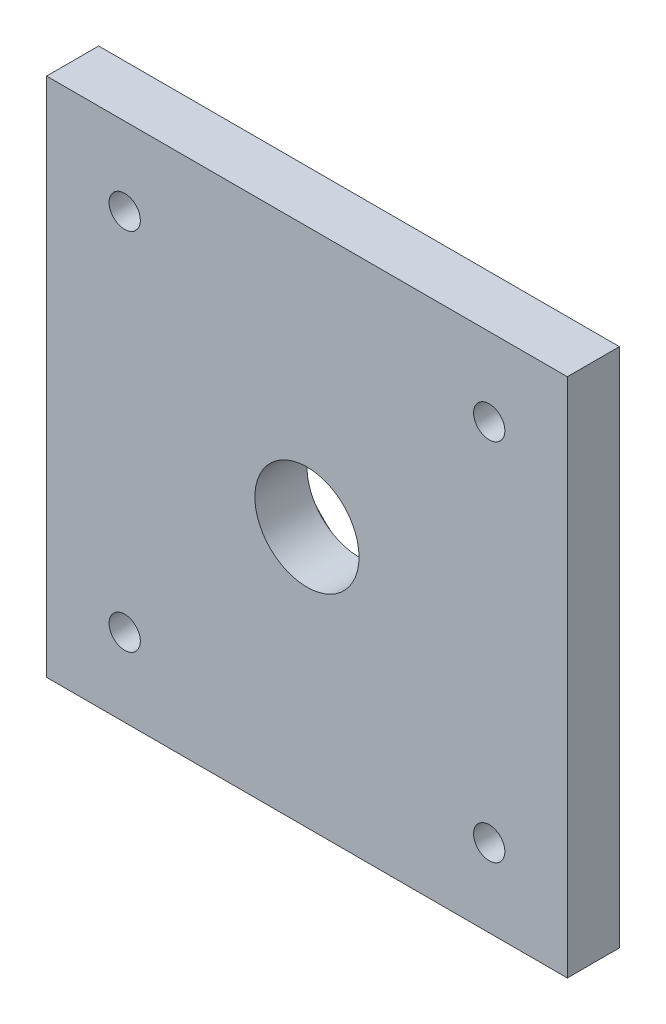
ISO-10303-21;
HEADER;
FILE_DESCRIPTION(('STEP AP214'),'2;1');
FILE_NAME('part.step','',(''),(''),'','','');
FILE_SCHEMA(('AUTOMOTIVE_DESIGN { 1 0 10303 214 1 1 1 1 }'));
ENDSEC;
DATA;
#1=APPLICATION_CONTEXT('core data for automotive mechanical design processes');
#2=APPLICATION_PROTOCOL_DEFINITION('international standard','automotive_design',2000,#1);
#3=PRODUCT_CONTEXT('',#1,'mechanical');
#4=PRODUCT('Part','Part','',(#3));
#5=PRODUCT_RELATED_PRODUCT_CATEGORY('part','',(#4));
#6=PRODUCT_DEFINITION_FORMATION('','',#4);
#7=PRODUCT_DEFINITION_CONTEXT('part definition',#1,'design');
#8=PRODUCT_DEFINITION('design','',#6,#7);
#9=PRODUCT_DEFINITION_SHAPE('','',#8);
#10=(LENGTH_UNIT() NAMED_UNIT(*) SI_UNIT(.MILLI.,.METRE.));
#11=(NAMED_UNIT(*) PLANE_ANGLE_UNIT() SI_UNIT($,.RADIAN.));
#12=(NAMED_UNIT(*) SI_UNIT($,.STERADIAN.) SOLID_ANGLE_UNIT());
#13=UNCERTAINTY_MEASURE_WITH_UNIT(LENGTH_MEASURE(1.E-05),#10,'distance_accuracy_value','');
#14=(GEOMETRIC_REPRESENTATION_CONTEXT(3) GLOBAL_UNCERTAINTY_ASSIGNED_CONTEXT((#13)) GLOBAL_UNIT_ASSIGNED_CONTEXT((#10,
#11,#12)) REPRESENTATION_CONTEXT('',''));
#15=CARTESIAN_POINT('',(0.,0.,0.));
#16=DIRECTION('',(0.,0.,1.));
#17=DIRECTION('',(1.,0.,0.));
#18=AXIS2_PLACEMENT_3D('',#15,#16,#17);
#19=CARTESIAN_POINT('',(0.,0.,-5.));
#20=DIRECTION('',(0.,0.,1.));
#21=DIRECTION('',(1.,0.,0.));
#22=AXIS2_PLACEMENT_3D('',#19,#20,#21);
#23=CYLINDRICAL_SURFACE('',#22,17.);
#24=CARTESIAN_POINT('',(0.,0.,-5.));
#25=DIRECTION('',(0.,0.,1.));
#26=DIRECTION('',(1.,0.,0.));
#27=AXIS2_PLACEMENT_3D('',#24,#25,#26);
#28=CIRCLE('',#27,17.);
#29=CARTESIAN_POINT('',(17.,0.,-5.));
#30=VERTEX_POINT('',#29);
#31=EDGE_CURVE('E11',#30,#30,#28,.T.);
#32=ORIENTED_EDGE('',*,*,#31,.T.);
#33=EDGE_LOOP('',(#32));
#34=FACE_BOUND('',#33,.T.);
#35=CARTESIAN_POINT('',(0.,0.,0.));
#36=DIRECTION('',(0.,0.,1.));
#37=DIRECTION('',(1.,0.,0.));
#38=AXIS2_PLACEMENT_3D('',#35,#36,#37);
#39=CIRCLE('',#38,17.);
#40=CARTESIAN_POINT('',(17.,0.,0.));
#41=VERTEX_POINT('',#40);
#42=EDGE_CURVE('E41',#41,#41,#39,.T.);
#43=ORIENTED_EDGE('',*,*,#42,.F.);
#44=EDGE_LOOP('',(#43));
#45=FACE_BOUND('',#44,.T.);
#46=ADVANCED_FACE('F32',(#34,#45),#23,.T.);
#47=CARTESIAN_POINT('',(0.,0.,-5.));
#48=DIRECTION('',(0.,0.,1.));
#49=DIRECTION('',(1.,0.,0.));
#50=AXIS2_PLACEMENT_3D('',#47,#48,#49);
#51=PLANE('',#50);
#52=CARTESIAN_POINT('',(0.,0.,-5.));
#53=DIRECTION('',(0.,0.,1.));
#54=DIRECTION('',(1.,0.,0.));
#55=AXIS2_PLACEMENT_3D('',#52,#53,#54);
#56=CIRCLE('',#55,12.);
#57=CARTESIAN_POINT('',(12.,0.,-5.));
#58=VERTEX_POINT('',#57);
#59=EDGE_CURVE('E111',#58,#58,#56,.T.);
#60=ORIENTED_EDGE('',*,*,#59,.T.);
#61=EDGE_LOOP('',(#60));
#62=FACE_BOUND('',#61,.T.);
#63=ORIENTED_EDGE('',*,*,#31,.F.);
#64=EDGE_LOOP('',(#63));
#65=FACE_BOUND('',#64,.T.);
#66=ADVANCED_FACE('F122',(#62,#65),#51,.F.);
#67=CARTESIAN_POINT('',(0.,0.,-5.));
#68=DIRECTION('',(0.,0.,1.));
#69=DIRECTION('',(1.,0.,0.));
#70=AXIS2_PLACEMENT_3D('',#67,#68,#69);
#71=CYLINDRICAL_SURFACE('',#70,12.);
#72=ORIENTED_EDGE('',*,*,#59,.F.);
#73=EDGE_LOOP('',(#72));
#74=FACE_BOUND('',#73,.T.);
#75=CARTESIAN_POINT('',(0.,0.,0.));
#76=DIRECTION('',(0.,0.,1.));
#77=DIRECTION('',(1.,0.,0.));
#78=AXIS2_PLACEMENT_3D('',#75,#76,#77);
#79=CIRCLE('',#78,12.);
#80=CARTESIAN_POINT('',(12.,0.,0.));
#81=VERTEX_POINT('',#80);
#82=EDGE_CURVE('E110',#81,#81,#79,.T.);
#83=ORIENTED_EDGE('',*,*,#82,.T.);
#84=EDGE_LOOP('',(#83));
#85=FACE_BOUND('',#84,.T.);
#86=ADVANCED_FACE('F127',(#74,#85),#71,.F.);
#87=CARTESIAN_POINT('',(0.,0.,0.));
#88=DIRECTION('',(0.,0.,1.));
#89=DIRECTION('',(1.,0.,0.));
#90=AXIS2_PLACEMENT_3D('',#87,#88,#89);
#91=PLANE('',#90);
#92=CARTESIAN_POINT('',(17.5,17.5,0.));
#93=DIRECTION('',(0.,0.,1.));
#94=DIRECTION('',(1.,0.,0.));
#95=AXIS2_PLACEMENT_3D('',#92,#93,#94);
#96=CIRCLE('',#95,1.5);
#97=CARTESIAN_POINT('',(19.,17.5,0.));
#98=VERTEX_POINT('',#97);
#99=EDGE_CURVE('E188',#98,#98,#96,.T.);
#100=ORIENTED_EDGE('',*,*,#99,.T.);
#101=EDGE_LOOP('',(#100));
#102=FACE_BOUND('',#101,.T.);
#103=CARTESIAN_POINT('',(-17.5,-17.5,0.));
#104=DIRECTION('',(0.,0.,1.));
#105=DIRECTION('',(1.,0.,0.));
#106=AXIS2_PLACEMENT_3D('',#103,#104,#105);
#107=CIRCLE('',#106,1.5);
#108=CARTESIAN_POINT('',(-16.,-17.5,0.));
#109=VERTEX_POINT('',#108);
#110=EDGE_CURVE('E184',#109,#109,#107,.T.);
#111=ORIENTED_EDGE('',*,*,#110,.T.);
#112=EDGE_LOOP('',(#111));
#113=FACE_BOUND('',#112,.T.);
#114=CARTESIAN_POINT('',(17.5,-17.5,0.));
#115=DIRECTION('',(0.,0.,1.));
#116=DIRECTION('',(1.,0.,0.));
#117=AXIS2_PLACEMENT_3D('',#114,#115,#116);
#118=CIRCLE('',#117,1.5);
#119=CARTESIAN_POINT('',(19.,-17.5,0.));
#120=VERTEX_POINT('',#119);
#121=EDGE_CURVE('E182',#120,#120,#118,.T.);
#122=ORIENTED_EDGE('',*,*,#121,.T.);
#123=EDGE_LOOP('',(#122));
#124=FACE_BOUND('',#123,.T.);
#125=CARTESIAN_POINT('',(-17.5,17.5,0.));
#126=DIRECTION('',(0.,0.,1.));
#127=DIRECTION('',(1.,0.,0.));
#128=AXIS2_PLACEMENT_3D('',#125,#126,#127);
#129=CIRCLE('',#128,1.5);
#130=CARTESIAN_POINT('',(-16.,17.5,0.));
#131=VERTEX_POINT('',#130);
#132=EDGE_CURVE('E185',#131,#131,#129,.T.);
#133=ORIENTED_EDGE('',*,*,#132,.T.);
#134=EDGE_LOOP('',(#133));
#135=FACE_BOUND('',#134,.T.);
#136=ORIENTED_EDGE('',*,*,#42,.T.);
#137=EDGE_LOOP('',(#136));
#138=FACE_BOUND('',#137,.T.);
#139=DIRECTION('',(0.,-1.,0.));
#140=VECTOR('',#139,1.);
#141=CARTESIAN_POINT('',(-25.,25.,0.));
#142=LINE('',#141,#140);
#143=CARTESIAN_POINT('',(-25.,25.,0.));
#144=VERTEX_POINT('',#143);
#145=CARTESIAN_POINT('',(-25.,-25.,0.));
#146=VERTEX_POINT('',#145);
#147=EDGE_CURVE('E101',#144,#146,#142,.T.);
#148=ORIENTED_EDGE('',*,*,#147,.F.);
#149=DIRECTION('',(-1.,0.,0.));
#150=VECTOR('',#149,1.);
#151=CARTESIAN_POINT('',(-25.,25.,0.));
#152=LINE('',#151,#150);
#153=CARTESIAN_POINT('',(25.,25.,0.));
#154=VERTEX_POINT('',#153);
#155=EDGE_CURVE('E73',#154,#144,#152,.T.);
#156=ORIENTED_EDGE('',*,*,#155,.F.);
#157=DIRECTION('',(0.,1.,0.));
#158=VECTOR('',#157,1.);
#159=CARTESIAN_POINT('',(25.,25.,0.));
#160=LINE('',#159,#158);
#161=CARTESIAN_POINT('',(25.,-25.,0.));
#162=VERTEX_POINT('',#161);
#163=EDGE_CURVE('E67',#162,#154,#160,.T.);
#164=ORIENTED_EDGE('',*,*,#163,.F.);
#165=DIRECTION('',(1.,0.,0.));
#166=VECTOR('',#165,1.);
#167=CARTESIAN_POINT('',(-25.,-25.,0.));
#168=LINE('',#167,#166);
#169=EDGE_CURVE('E91',#146,#162,#168,.T.);
#170=ORIENTED_EDGE('',*,*,#169,.F.);
#171=EDGE_LOOP('',(#148,#156,#164,#170));
#172=FACE_BOUND('',#171,.T.);
#173=ADVANCED_FACE('F118',(#102,#113,#124,#135,#138,#172),#91,.F.);
#174=CARTESIAN_POINT('',(0.,0.,5.));
#175=DIRECTION('',(0.,0.,1.));
#176=DIRECTION('',(1.,0.,0.));
#177=AXIS2_PLACEMENT_3D('',#174,#175,#176);
#178=PLANE('',#177);
#179=CARTESIAN_POINT('',(17.5,17.5,5.));
#180=DIRECTION('',(0.,0.,1.));
#181=DIRECTION('',(-1.,0.,0.));
#182=AXIS2_PLACEMENT_3D('',#179,#180,#181);
#183=CIRCLE('',#182,1.5);
#184=CARTESIAN_POINT('',(16.,17.5,5.));
#185=VERTEX_POINT('',#184);
#186=EDGE_CURVE('E303',#185,#185,#183,.T.);
#187=ORIENTED_EDGE('',*,*,#186,.F.);
#188=EDGE_LOOP('',(#187));
#189=FACE_BOUND('',#188,.T.);
#190=CARTESIAN_POINT('',(-17.5,-17.5,5.));
#191=DIRECTION('',(0.,0.,1.));
#192=DIRECTION('',(-1.,0.,0.));
#193=AXIS2_PLACEMENT_3D('',#190,#191,#192);
#194=CIRCLE('',#193,1.5);
#195=CARTESIAN_POINT('',(-19.,-17.5,5.));
#196=VERTEX_POINT('',#195);
#197=EDGE_CURVE('E304',#196,#196,#194,.T.);
#198=ORIENTED_EDGE('',*,*,#197,.F.);
#199=EDGE_LOOP('',(#198));
#200=FACE_BOUND('',#199,.T.);
#201=CARTESIAN_POINT('',(17.5,-17.5,5.));
#202=DIRECTION('',(0.,0.,1.));
#203=DIRECTION('',(1.,0.,0.));
#204=AXIS2_PLACEMENT_3D('',#201,#202,#203);
#205=CIRCLE('',#204,1.5);
#206=CARTESIAN_POINT('',(19.,-17.5,5.));
#207=VERTEX_POINT('',#206);
#208=EDGE_CURVE('E179',#207,#207,#205,.T.);
#209=ORIENTED_EDGE('',*,*,#208,.F.);
#210=EDGE_LOOP('',(#209));
#211=FACE_BOUND('',#210,.T.);
#212=CARTESIAN_POINT('',(-17.5,17.5,5.));
#213=DIRECTION('',(0.,0.,1.));
#214=DIRECTION('',(1.,0.,0.));
#215=AXIS2_PLACEMENT_3D('',#212,#213,#214);
#216=CIRCLE('',#215,1.5);
#217=CARTESIAN_POINT('',(-16.,17.5,5.));
#218=VERTEX_POINT('',#217);
#219=EDGE_CURVE('E191',#218,#218,#216,.T.);
#220=ORIENTED_EDGE('',*,*,#219,.F.);
#221=EDGE_LOOP('',(#220));
#222=FACE_BOUND('',#221,.T.);
#223=CARTESIAN_POINT('',(0.,0.,5.));
#224=DIRECTION('',(0.,0.,1.));
#225=DIRECTION('',(1.,0.,0.));
#226=AXIS2_PLACEMENT_3D('',#223,#224,#225);
#227=CIRCLE('',#226,5.);
#228=CARTESIAN_POINT('',(5.,0.,5.));
#229=VERTEX_POINT('',#228);
#230=EDGE_CURVE('E197',#229,#229,#227,.T.);
#231=ORIENTED_EDGE('',*,*,#230,.F.);
#232=EDGE_LOOP('',(#231));
#233=FACE_BOUND('',#232,.T.);
#234=DIRECTION('',(0.,-1.,0.));
#235=VECTOR('',#234,1.);
#236=CARTESIAN_POINT('',(-25.,25.,5.));
#237=LINE('',#236,#235);
#238=CARTESIAN_POINT('',(-25.,25.,5.));
#239=VERTEX_POINT('',#238);
#240=CARTESIAN_POINT('',(-25.,-25.,5.));
#241=VERTEX_POINT('',#240);
#242=EDGE_CURVE('E86',#239,#241,#237,.T.);
#243=ORIENTED_EDGE('',*,*,#242,.T.);
#244=DIRECTION('',(1.,0.,0.));
#245=VECTOR('',#244,1.);
#246=CARTESIAN_POINT('',(-25.,-25.,5.));
#247=LINE('',#246,#245);
#248=CARTESIAN_POINT('',(25.,-25.,5.));
#249=VERTEX_POINT('',#248);
#250=EDGE_CURVE('E81',#241,#249,#247,.T.);
#251=ORIENTED_EDGE('',*,*,#250,.T.);
#252=DIRECTION('',(0.,1.,0.));
#253=VECTOR('',#252,1.);
#254=CARTESIAN_POINT('',(25.,25.,5.));
#255=LINE('',#254,#253);
#256=CARTESIAN_POINT('',(25.,25.,5.));
#257=VERTEX_POINT('',#256);
#258=EDGE_CURVE('E84',#249,#257,#255,.T.);
#259=ORIENTED_EDGE('',*,*,#258,.T.);
#260=DIRECTION('',(-1.,0.,0.));
#261=VECTOR('',#260,1.);
#262=CARTESIAN_POINT('',(-25.,25.,5.));
#263=LINE('',#262,#261);
#264=EDGE_CURVE('E50',#257,#239,#263,.T.);
#265=ORIENTED_EDGE('',*,*,#264,.T.);
#266=EDGE_LOOP('',(#243,#251,#259,#265));
#267=FACE_BOUND('',#266,.T.);
#268=ADVANCED_FACE('F82',(#189,#200,#211,#222,#233,#267),#178,.T.);
#269=CARTESIAN_POINT('',(-25.,25.,5.));
#270=DIRECTION('',(0.,-1.,0.));
#271=DIRECTION('',(0.,0.,-1.));
#272=AXIS2_PLACEMENT_3D('',#269,#270,#271);
#273=PLANE('',#272);
#274=ORIENTED_EDGE('',*,*,#155,.T.);
#275=DIRECTION('',(0.,0.,-1.));
#276=VECTOR('',#275,1.);
#277=CARTESIAN_POINT('',(-25.,25.,5.));
#278=LINE('',#277,#276);
#279=EDGE_CURVE('E97',#239,#144,#278,.T.);
#280=ORIENTED_EDGE('',*,*,#279,.F.);
#281=ORIENTED_EDGE('',*,*,#264,.F.);
#282=DIRECTION('',(0.,0.,-1.));
#283=VECTOR('',#282,1.);
#284=CARTESIAN_POINT('',(25.,25.,5.));
#285=LINE('',#284,#283);
#286=EDGE_CURVE('E93',#257,#154,#285,.T.);
#287=ORIENTED_EDGE('',*,*,#286,.T.);
#288=EDGE_LOOP('',(#274,#280,#281,#287));
#289=FACE_BOUND('',#288,.T.);
#290=ADVANCED_FACE('F146',(#289),#273,.F.);
#291=CARTESIAN_POINT('',(25.,25.,5.));
#292=DIRECTION('',(-1.,0.,0.));
#293=DIRECTION('',(0.,-1.,0.));
#294=AXIS2_PLACEMENT_3D('',#291,#292,#293);
#295=PLANE('',#294);
#296=ORIENTED_EDGE('',*,*,#163,.T.);
#297=ORIENTED_EDGE('',*,*,#286,.F.);
#298=ORIENTED_EDGE('',*,*,#258,.F.);
#299=DIRECTION('',(0.,0.,-1.));
#300=VECTOR('',#299,1.);
#301=CARTESIAN_POINT('',(25.,-25.,5.));
#302=LINE('',#301,#300);
#303=EDGE_CURVE('E89',#249,#162,#302,.T.);
#304=ORIENTED_EDGE('',*,*,#303,.T.);
#305=EDGE_LOOP('',(#296,#297,#298,#304));
#306=FACE_BOUND('',#305,.T.);
#307=ADVANCED_FACE('F95',(#306),#295,.F.);
#308=CARTESIAN_POINT('',(-25.,-25.,5.));
#309=DIRECTION('',(0.,1.,0.));
#310=DIRECTION('',(0.,0.,1.));
#311=AXIS2_PLACEMENT_3D('',#308,#309,#310);
#312=PLANE('',#311);
#313=ORIENTED_EDGE('',*,*,#169,.T.);
#314=ORIENTED_EDGE('',*,*,#303,.F.);
#315=ORIENTED_EDGE('',*,*,#250,.F.);
#316=DIRECTION('',(0.,0.,-1.));
#317=VECTOR('',#316,1.);
#318=CARTESIAN_POINT('',(-25.,-25.,5.));
#319=LINE('',#318,#317);
#320=EDGE_CURVE('E92',#241,#146,#319,.T.);
#321=ORIENTED_EDGE('',*,*,#320,.T.);
#322=EDGE_LOOP('',(#313,#314,#315,#321));
#323=FACE_BOUND('',#322,.T.);
#324=ADVANCED_FACE('F90',(#323),#312,.F.);
#325=CARTESIAN_POINT('',(-25.,25.,5.));
#326=DIRECTION('',(1.,0.,0.));
#327=DIRECTION('',(0.,1.,0.));
#328=AXIS2_PLACEMENT_3D('',#325,#326,#327);
#329=PLANE('',#328);
#330=ORIENTED_EDGE('',*,*,#147,.T.);
#331=ORIENTED_EDGE('',*,*,#320,.F.);
#332=ORIENTED_EDGE('',*,*,#242,.F.);
#333=ORIENTED_EDGE('',*,*,#279,.T.);
#334=EDGE_LOOP('',(#330,#331,#332,#333));
#335=FACE_BOUND('',#334,.T.);
#336=ADVANCED_FACE('F137',(#335),#329,.F.);
#337=CARTESIAN_POINT('',(0.,0.,0.));
#338=DIRECTION('',(0.,0.,1.));
#339=DIRECTION('',(1.,0.,0.));
#340=AXIS2_PLACEMENT_3D('',#337,#338,#339);
#341=CIRCLE('',#340,5.);
#342=CARTESIAN_POINT('',(5.,0.,0.));
#343=VERTEX_POINT('',#342);
#344=EDGE_CURVE('E35',#343,#343,#341,.T.);
#345=ORIENTED_EDGE('',*,*,#344,.T.);
#346=EDGE_LOOP('',(#345));
#347=FACE_BOUND('',#346,.T.);
#348=ORIENTED_EDGE('',*,*,#82,.F.);
#349=EDGE_LOOP('',(#348));
#350=FACE_BOUND('',#349,.T.);
#351=ADVANCED_FACE('F140',(#347,#350),#91,.F.);
#352=CARTESIAN_POINT('',(0.,0.,-5.));
#353=DIRECTION('',(0.,0.,1.));
#354=DIRECTION('',(1.,0.,0.));
#355=AXIS2_PLACEMENT_3D('',#352,#353,#354);
#356=CYLINDRICAL_SURFACE('',#355,5.);
#357=ORIENTED_EDGE('',*,*,#230,.T.);
#358=EDGE_LOOP('',(#357));
#359=FACE_BOUND('',#358,.T.);
#360=ORIENTED_EDGE('',*,*,#344,.F.);
#361=EDGE_LOOP('',(#360));
#362=FACE_BOUND('',#361,.T.);
#363=ADVANCED_FACE('F155',(#359,#362),#356,.F.);
#364=CARTESIAN_POINT('',(-17.5,17.5,-5.));
#365=DIRECTION('',(0.,0.,1.));
#366=DIRECTION('',(1.,0.,0.));
#367=AXIS2_PLACEMENT_3D('',#364,#365,#366);
#368=CYLINDRICAL_SURFACE('',#367,1.5);
#369=ORIENTED_EDGE('',*,*,#219,.T.);
#370=EDGE_LOOP('',(#369));
#371=FACE_BOUND('',#370,.T.);
#372=ORIENTED_EDGE('',*,*,#132,.F.);
#373=EDGE_LOOP('',(#372));
#374=FACE_BOUND('',#373,.T.);
#375=ADVANCED_FACE('F158',(#371,#374),#368,.F.);
#376=CARTESIAN_POINT('',(17.5,-17.5,-5.));
#377=DIRECTION('',(0.,0.,1.));
#378=DIRECTION('',(1.,0.,0.));
#379=AXIS2_PLACEMENT_3D('',#376,#377,#378);
#380=CYLINDRICAL_SURFACE('',#379,1.5);
#381=ORIENTED_EDGE('',*,*,#208,.T.);
#382=EDGE_LOOP('',(#381));
#383=FACE_BOUND('',#382,.T.);
#384=ORIENTED_EDGE('',*,*,#121,.F.);
#385=EDGE_LOOP('',(#384));
#386=FACE_BOUND('',#385,.T.);
#387=ADVANCED_FACE('F162',(#383,#386),#380,.F.);
#388=CARTESIAN_POINT('',(-17.5,-17.5,-5.));
#389=DIRECTION('',(0.,0.,1.));
#390=DIRECTION('',(1.,0.,0.));
#391=AXIS2_PLACEMENT_3D('',#388,#389,#390);
#392=CYLINDRICAL_SURFACE('',#391,1.5);
#393=ORIENTED_EDGE('',*,*,#197,.T.);
#394=EDGE_LOOP('',(#393));
#395=FACE_BOUND('',#394,.T.);
#396=ORIENTED_EDGE('',*,*,#110,.F.);
#397=EDGE_LOOP('',(#396));
#398=FACE_BOUND('',#397,.T.);
#399=ADVANCED_FACE('F164',(#395,#398),#392,.F.);
#400=CARTESIAN_POINT('',(17.5,17.5,-5.));
#401=DIRECTION('',(0.,0.,1.));
#402=DIRECTION('',(1.,0.,0.));
#403=AXIS2_PLACEMENT_3D('',#400,#401,#402);
#404=CYLINDRICAL_SURFACE('',#403,1.5);
#405=ORIENTED_EDGE('',*,*,#186,.T.);
#406=EDGE_LOOP('',(#405));
#407=FACE_BOUND('',#406,.T.);
#408=ORIENTED_EDGE('',*,*,#99,.F.);
#409=EDGE_LOOP('',(#408));
#410=FACE_BOUND('',#409,.T.);
#411=ADVANCED_FACE('F167',(#407,#410),#404,.F.);
#412=CLOSED_SHELL('',(#46,#66,#86,#173,#268,#290,#307,#324,#336,#351,#363,#375,#387,#399,#411));
#413=MANIFOLD_SOLID_BREP('B2',#412);
#414=ADVANCED_BREP_SHAPE_REPRESENTATION('',(#18,#413),#14);
#415=SHAPE_DEFINITION_REPRESENTATION(#9,#414);
ENDSEC;
END-ISO-10303-21;
